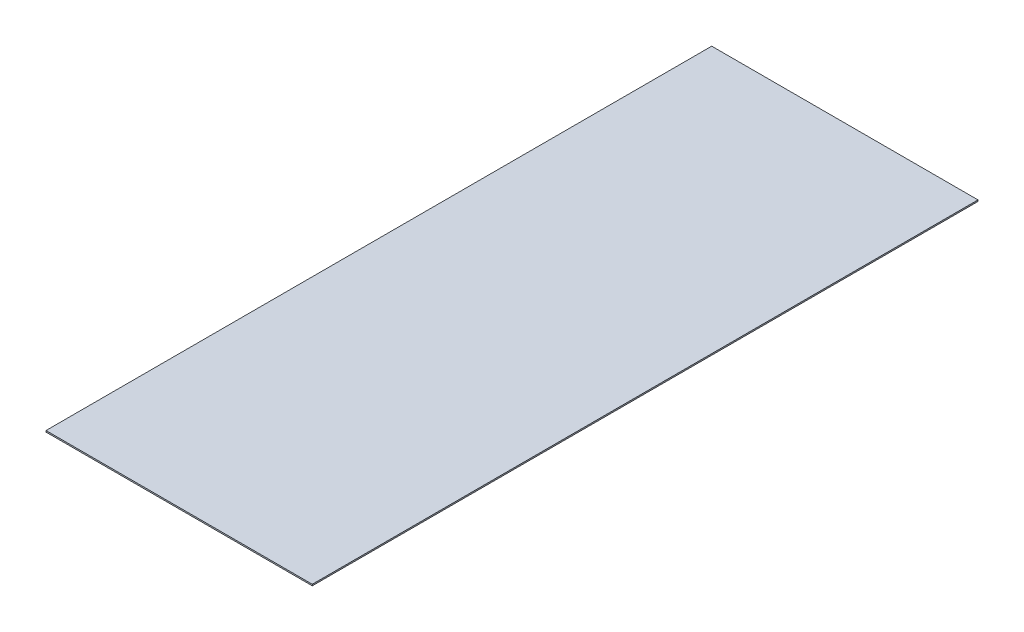
ISO-10303-21;
HEADER;
FILE_DESCRIPTION(('STEP AP214'),'2;1');
FILE_NAME('part.step','',(''),(''),'','','');
FILE_SCHEMA(('AUTOMOTIVE_DESIGN { 1 0 10303 214 1 1 1 1 }'));
ENDSEC;
DATA;
#1=APPLICATION_CONTEXT('core data for automotive mechanical design processes');
#2=APPLICATION_PROTOCOL_DEFINITION('international standard','automotive_design',2000,#1);
#3=PRODUCT_CONTEXT('',#1,'mechanical');
#4=PRODUCT('Part','Part','',(#3));
#5=PRODUCT_RELATED_PRODUCT_CATEGORY('part','',(#4));
#6=PRODUCT_DEFINITION_FORMATION('','',#4);
#7=PRODUCT_DEFINITION_CONTEXT('part definition',#1,'design');
#8=PRODUCT_DEFINITION('design','',#6,#7);
#9=PRODUCT_DEFINITION_SHAPE('','',#8);
#10=(LENGTH_UNIT() NAMED_UNIT(*) SI_UNIT(.MILLI.,.METRE.));
#11=(NAMED_UNIT(*) PLANE_ANGLE_UNIT() SI_UNIT($,.RADIAN.));
#12=(NAMED_UNIT(*) SI_UNIT($,.STERADIAN.) SOLID_ANGLE_UNIT());
#13=UNCERTAINTY_MEASURE_WITH_UNIT(LENGTH_MEASURE(1.E-05),#10,'distance_accuracy_value','');
#14=(GEOMETRIC_REPRESENTATION_CONTEXT(3) GLOBAL_UNCERTAINTY_ASSIGNED_CONTEXT((#13)) GLOBAL_UNIT_ASSIGNED_CONTEXT((#10,
#11,#12)) REPRESENTATION_CONTEXT('',''));
#15=CARTESIAN_POINT('',(0.,0.,0.));
#16=DIRECTION('',(0.,0.,1.));
#17=DIRECTION('',(1.,0.,0.));
#18=AXIS2_PLACEMENT_3D('',#15,#16,#17);
#19=CARTESIAN_POINT('',(609.6,6.4,1524.));
#20=DIRECTION('',(-1.,0.,0.));
#21=DIRECTION('',(0.,0.,1.));
#22=AXIS2_PLACEMENT_3D('',#19,#20,#21);
#23=PLANE('',#22);
#24=DIRECTION('',(0.,0.,-1.));
#25=VECTOR('',#24,1.);
#26=CARTESIAN_POINT('',(609.6,0.,1524.));
#27=LINE('',#26,#25);
#28=CARTESIAN_POINT('',(609.6,0.,1524.));
#29=VERTEX_POINT('',#28);
#30=CARTESIAN_POINT('',(609.6,0.,-1524.));
#31=VERTEX_POINT('',#30);
#32=EDGE_CURVE('E96',#29,#31,#27,.T.);
#33=ORIENTED_EDGE('',*,*,#32,.T.);
#34=DIRECTION('',(0.,-1.,0.));
#35=VECTOR('',#34,1.);
#36=CARTESIAN_POINT('',(609.6,6.4,-1524.));
#37=LINE('',#36,#35);
#38=CARTESIAN_POINT('',(609.6,6.4,-1524.));
#39=VERTEX_POINT('',#38);
#40=EDGE_CURVE('E11',#39,#31,#37,.T.);
#41=ORIENTED_EDGE('',*,*,#40,.F.);
#42=DIRECTION('',(0.,0.,-1.));
#43=VECTOR('',#42,1.);
#44=CARTESIAN_POINT('',(609.6,6.4,1524.));
#45=LINE('',#44,#43);
#46=CARTESIAN_POINT('',(609.6,6.4,1524.));
#47=VERTEX_POINT('',#46);
#48=EDGE_CURVE('E84',#47,#39,#45,.T.);
#49=ORIENTED_EDGE('',*,*,#48,.F.);
#50=DIRECTION('',(0.,-1.,0.));
#51=VECTOR('',#50,1.);
#52=CARTESIAN_POINT('',(609.6,6.4,1524.));
#53=LINE('',#52,#51);
#54=EDGE_CURVE('E92',#47,#29,#53,.T.);
#55=ORIENTED_EDGE('',*,*,#54,.T.);
#56=EDGE_LOOP('',(#33,#41,#49,#55));
#57=FACE_BOUND('',#56,.T.);
#58=ADVANCED_FACE('F33',(#57),#23,.F.);
#59=CARTESIAN_POINT('',(-609.6,6.4,-1524.));
#60=DIRECTION('',(0.,0.,1.));
#61=DIRECTION('',(1.,0.,0.));
#62=AXIS2_PLACEMENT_3D('',#59,#60,#61);
#63=PLANE('',#62);
#64=DIRECTION('',(-1.,0.,0.));
#65=VECTOR('',#64,1.);
#66=CARTESIAN_POINT('',(-609.6,0.,-1524.));
#67=LINE('',#66,#65);
#68=CARTESIAN_POINT('',(-609.6,0.,-1524.));
#69=VERTEX_POINT('',#68);
#70=EDGE_CURVE('E88',#31,#69,#67,.T.);
#71=ORIENTED_EDGE('',*,*,#70,.T.);
#72=DIRECTION('',(0.,-1.,0.));
#73=VECTOR('',#72,1.);
#74=CARTESIAN_POINT('',(-609.6,6.4,-1524.));
#75=LINE('',#74,#73);
#76=CARTESIAN_POINT('',(-609.6,6.4,-1524.));
#77=VERTEX_POINT('',#76);
#78=EDGE_CURVE('E41',#77,#69,#75,.T.);
#79=ORIENTED_EDGE('',*,*,#78,.F.);
#80=DIRECTION('',(-1.,0.,0.));
#81=VECTOR('',#80,1.);
#82=CARTESIAN_POINT('',(-609.6,6.4,-1524.));
#83=LINE('',#82,#81);
#84=EDGE_CURVE('E79',#39,#77,#83,.T.);
#85=ORIENTED_EDGE('',*,*,#84,.F.);
#86=ORIENTED_EDGE('',*,*,#40,.T.);
#87=EDGE_LOOP('',(#71,#79,#85,#86));
#88=FACE_BOUND('',#87,.T.);
#89=ADVANCED_FACE('F87',(#88),#63,.F.);
#90=CARTESIAN_POINT('',(-609.6,6.4,1524.));
#91=DIRECTION('',(1.,0.,0.));
#92=DIRECTION('',(0.,0.,-1.));
#93=AXIS2_PLACEMENT_3D('',#90,#91,#92);
#94=PLANE('',#93);
#95=DIRECTION('',(0.,0.,1.));
#96=VECTOR('',#95,1.);
#97=CARTESIAN_POINT('',(-609.6,0.,1524.));
#98=LINE('',#97,#96);
#99=CARTESIAN_POINT('',(-609.6,0.,1524.));
#100=VERTEX_POINT('',#99);
#101=EDGE_CURVE('E66',#69,#100,#98,.T.);
#102=ORIENTED_EDGE('',*,*,#101,.T.);
#103=DIRECTION('',(0.,-1.,0.));
#104=VECTOR('',#103,1.);
#105=CARTESIAN_POINT('',(-609.6,6.4,1524.));
#106=LINE('',#105,#104);
#107=CARTESIAN_POINT('',(-609.6,6.4,1524.));
#108=VERTEX_POINT('',#107);
#109=EDGE_CURVE('E89',#108,#100,#106,.T.);
#110=ORIENTED_EDGE('',*,*,#109,.F.);
#111=DIRECTION('',(0.,0.,1.));
#112=VECTOR('',#111,1.);
#113=CARTESIAN_POINT('',(-609.6,6.4,1524.));
#114=LINE('',#113,#112);
#115=EDGE_CURVE('E82',#77,#108,#114,.T.);
#116=ORIENTED_EDGE('',*,*,#115,.F.);
#117=ORIENTED_EDGE('',*,*,#78,.T.);
#118=EDGE_LOOP('',(#102,#110,#116,#117));
#119=FACE_BOUND('',#118,.T.);
#120=ADVANCED_FACE('F90',(#119),#94,.F.);
#121=CARTESIAN_POINT('',(-609.6,6.4,1524.));
#122=DIRECTION('',(0.,0.,-1.));
#123=DIRECTION('',(-1.,0.,0.));
#124=AXIS2_PLACEMENT_3D('',#121,#122,#123);
#125=PLANE('',#124);
#126=DIRECTION('',(1.,0.,0.));
#127=VECTOR('',#126,1.);
#128=CARTESIAN_POINT('',(-609.6,0.,1524.));
#129=LINE('',#128,#127);
#130=EDGE_CURVE('E72',#100,#29,#129,.T.);
#131=ORIENTED_EDGE('',*,*,#130,.T.);
#132=ORIENTED_EDGE('',*,*,#54,.F.);
#133=DIRECTION('',(1.,0.,0.));
#134=VECTOR('',#133,1.);
#135=CARTESIAN_POINT('',(-609.6,6.4,1524.));
#136=LINE('',#135,#134);
#137=EDGE_CURVE('E49',#108,#47,#136,.T.);
#138=ORIENTED_EDGE('',*,*,#137,.F.);
#139=ORIENTED_EDGE('',*,*,#109,.T.);
#140=EDGE_LOOP('',(#131,#132,#138,#139));
#141=FACE_BOUND('',#140,.T.);
#142=ADVANCED_FACE('F103',(#141),#125,.F.);
#143=CARTESIAN_POINT('',(0.,6.4,0.));
#144=DIRECTION('',(0.,-1.,0.));
#145=DIRECTION('',(0.,0.,-1.));
#146=AXIS2_PLACEMENT_3D('',#143,#144,#145);
#147=PLANE('',#146);
#148=ORIENTED_EDGE('',*,*,#48,.T.);
#149=ORIENTED_EDGE('',*,*,#84,.T.);
#150=ORIENTED_EDGE('',*,*,#115,.T.);
#151=ORIENTED_EDGE('',*,*,#137,.T.);
#152=EDGE_LOOP('',(#148,#149,#150,#151));
#153=FACE_BOUND('',#152,.T.);
#154=ADVANCED_FACE('F80',(#153),#147,.F.);
#155=CARTESIAN_POINT('',(0.,0.,0.));
#156=DIRECTION('',(0.,-1.,0.));
#157=DIRECTION('',(0.,0.,-1.));
#158=AXIS2_PLACEMENT_3D('',#155,#156,#157);
#159=PLANE('',#158);
#160=ORIENTED_EDGE('',*,*,#32,.F.);
#161=ORIENTED_EDGE('',*,*,#130,.F.);
#162=ORIENTED_EDGE('',*,*,#101,.F.);
#163=ORIENTED_EDGE('',*,*,#70,.F.);
#164=EDGE_LOOP('',(#160,#161,#162,#163));
#165=FACE_BOUND('',#164,.T.);
#166=ADVANCED_FACE('F106',(#165),#159,.T.);
#167=CLOSED_SHELL('',(#58,#89,#120,#142,#154,#166));
#168=MANIFOLD_SOLID_BREP('B2',#167);
#169=ADVANCED_BREP_SHAPE_REPRESENTATION('',(#18,#168),#14);
#170=SHAPE_DEFINITION_REPRESENTATION(#9,#169);
ENDSEC;
END-ISO-10303-21;
